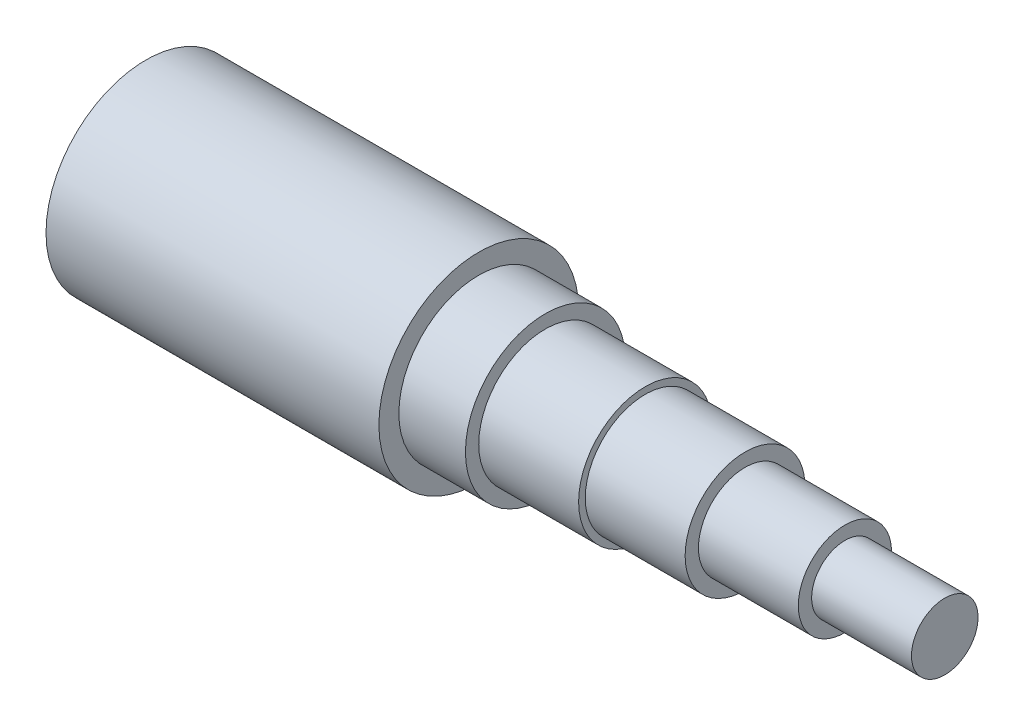
ISO-10303-21;
HEADER;
FILE_DESCRIPTION(('STEP AP214'),'2;1');
FILE_NAME('part.step','',(''),(''),'','','');
FILE_SCHEMA(('AUTOMOTIVE_DESIGN { 1 0 10303 214 1 1 1 1 }'));
ENDSEC;
DATA;
#1=APPLICATION_CONTEXT('core data for automotive mechanical design processes');
#2=APPLICATION_PROTOCOL_DEFINITION('international standard','automotive_design',2000,#1);
#3=PRODUCT_CONTEXT('',#1,'mechanical');
#4=PRODUCT('Part','Part','',(#3));
#5=PRODUCT_RELATED_PRODUCT_CATEGORY('part','',(#4));
#6=PRODUCT_DEFINITION_FORMATION('','',#4);
#7=PRODUCT_DEFINITION_CONTEXT('part definition',#1,'design');
#8=PRODUCT_DEFINITION('design','',#6,#7);
#9=PRODUCT_DEFINITION_SHAPE('','',#8);
#10=(LENGTH_UNIT() NAMED_UNIT(*) SI_UNIT(.MILLI.,.METRE.));
#11=(NAMED_UNIT(*) PLANE_ANGLE_UNIT() SI_UNIT($,.RADIAN.));
#12=(NAMED_UNIT(*) SI_UNIT($,.STERADIAN.) SOLID_ANGLE_UNIT());
#13=UNCERTAINTY_MEASURE_WITH_UNIT(LENGTH_MEASURE(1.E-05),#10,'distance_accuracy_value','');
#14=(GEOMETRIC_REPRESENTATION_CONTEXT(3) GLOBAL_UNCERTAINTY_ASSIGNED_CONTEXT((#13)) GLOBAL_UNIT_ASSIGNED_CONTEXT((#10,
#11,#12)) REPRESENTATION_CONTEXT('',''));
#15=CARTESIAN_POINT('',(0.,0.,0.));
#16=DIRECTION('',(0.,0.,1.));
#17=DIRECTION('',(1.,0.,0.));
#18=AXIS2_PLACEMENT_3D('',#15,#16,#17);
#19=CARTESIAN_POINT('',(0.,0.,0.));
#20=DIRECTION('',(-1.,0.,0.));
#21=DIRECTION('',(0.,0.,1.));
#22=AXIS2_PLACEMENT_3D('',#19,#20,#21);
#23=PLANE('',#22);
#24=CARTESIAN_POINT('',(0.,0.,0.));
#25=DIRECTION('',(-1.,0.,0.));
#26=DIRECTION('',(0.,0.,1.));
#27=AXIS2_PLACEMENT_3D('',#24,#25,#26);
#28=CIRCLE('',#27,9.525);
#29=CARTESIAN_POINT('',(0.,0.,9.525));
#30=VERTEX_POINT('',#29);
#31=EDGE_CURVE('E88',#30,#30,#28,.T.);
#32=ORIENTED_EDGE('',*,*,#31,.T.);
#33=EDGE_LOOP('',(#32));
#34=FACE_BOUND('',#33,.T.);
#35=ADVANCED_FACE('F37',(#34),#23,.T.);
#36=CARTESIAN_POINT('',(76.2,0.,0.));
#37=DIRECTION('',(1.,0.,0.));
#38=DIRECTION('',(0.,0.,-1.));
#39=AXIS2_PLACEMENT_3D('',#36,#37,#38);
#40=PLANE('',#39);
#41=CARTESIAN_POINT('',(76.2,0.,0.));
#42=DIRECTION('',(-1.,0.,0.));
#43=DIRECTION('',(0.,0.,1.));
#44=AXIS2_PLACEMENT_3D('',#41,#42,#43);
#45=CIRCLE('',#44,3.175);
#46=CARTESIAN_POINT('',(76.2,0.,3.175));
#47=VERTEX_POINT('',#46);
#48=EDGE_CURVE('E10',#47,#47,#45,.T.);
#49=ORIENTED_EDGE('',*,*,#48,.F.);
#50=EDGE_LOOP('',(#49));
#51=FACE_BOUND('',#50,.T.);
#52=ADVANCED_FACE('F106',(#51),#40,.T.);
#53=CARTESIAN_POINT('',(0.,0.,0.));
#54=DIRECTION('',(-1.,0.,0.));
#55=DIRECTION('',(0.,0.,1.));
#56=AXIS2_PLACEMENT_3D('',#53,#54,#55);
#57=CYLINDRICAL_SURFACE('',#56,3.175);
#58=ORIENTED_EDGE('',*,*,#48,.T.);
#59=EDGE_LOOP('',(#58));
#60=FACE_BOUND('',#59,.T.);
#61=CARTESIAN_POINT('',(66.675,0.,0.));
#62=DIRECTION('',(-1.,0.,0.));
#63=DIRECTION('',(0.,0.,1.));
#64=AXIS2_PLACEMENT_3D('',#61,#62,#63);
#65=CIRCLE('',#64,3.175);
#66=CARTESIAN_POINT('',(66.675,0.,3.175));
#67=VERTEX_POINT('',#66);
#68=EDGE_CURVE('E44',#67,#67,#65,.T.);
#69=ORIENTED_EDGE('',*,*,#68,.F.);
#70=EDGE_LOOP('',(#69));
#71=FACE_BOUND('',#70,.T.);
#72=ADVANCED_FACE('F110',(#60,#71),#57,.T.);
#73=CARTESIAN_POINT('',(66.675,0.,0.));
#74=DIRECTION('',(1.,0.,0.));
#75=DIRECTION('',(0.,0.,-1.));
#76=AXIS2_PLACEMENT_3D('',#73,#74,#75);
#77=PLANE('',#76);
#78=ORIENTED_EDGE('',*,*,#68,.T.);
#79=EDGE_LOOP('',(#78));
#80=FACE_BOUND('',#79,.T.);
#81=CARTESIAN_POINT('',(66.675,0.,0.));
#82=DIRECTION('',(-1.,0.,0.));
#83=DIRECTION('',(0.,0.,1.));
#84=AXIS2_PLACEMENT_3D('',#81,#82,#83);
#85=CIRCLE('',#84,4.445);
#86=CARTESIAN_POINT('',(66.675,0.,4.445));
#87=VERTEX_POINT('',#86);
#88=EDGE_CURVE('E49',#87,#87,#85,.T.);
#89=ORIENTED_EDGE('',*,*,#88,.F.);
#90=EDGE_LOOP('',(#89));
#91=FACE_BOUND('',#90,.T.);
#92=ADVANCED_FACE('F115',(#80,#91),#77,.T.);
#93=CARTESIAN_POINT('',(0.,0.,0.));
#94=DIRECTION('',(-1.,0.,0.));
#95=DIRECTION('',(0.,0.,1.));
#96=AXIS2_PLACEMENT_3D('',#93,#94,#95);
#97=CYLINDRICAL_SURFACE('',#96,4.445);
#98=ORIENTED_EDGE('',*,*,#88,.T.);
#99=EDGE_LOOP('',(#98));
#100=FACE_BOUND('',#99,.T.);
#101=CARTESIAN_POINT('',(57.15,0.,0.));
#102=DIRECTION('',(-1.,0.,0.));
#103=DIRECTION('',(0.,0.,1.));
#104=AXIS2_PLACEMENT_3D('',#101,#102,#103);
#105=CIRCLE('',#104,4.445);
#106=CARTESIAN_POINT('',(57.15,0.,4.445));
#107=VERTEX_POINT('',#106);
#108=EDGE_CURVE('E54',#107,#107,#105,.T.);
#109=ORIENTED_EDGE('',*,*,#108,.F.);
#110=EDGE_LOOP('',(#109));
#111=FACE_BOUND('',#110,.T.);
#112=ADVANCED_FACE('F120',(#100,#111),#97,.T.);
#113=CARTESIAN_POINT('',(57.15,0.,0.));
#114=DIRECTION('',(1.,0.,0.));
#115=DIRECTION('',(0.,0.,-1.));
#116=AXIS2_PLACEMENT_3D('',#113,#114,#115);
#117=PLANE('',#116);
#118=ORIENTED_EDGE('',*,*,#108,.T.);
#119=EDGE_LOOP('',(#118));
#120=FACE_BOUND('',#119,.T.);
#121=CARTESIAN_POINT('',(57.15,0.,0.));
#122=DIRECTION('',(-1.,0.,0.));
#123=DIRECTION('',(0.,0.,1.));
#124=AXIS2_PLACEMENT_3D('',#121,#122,#123);
#125=CIRCLE('',#124,5.715);
#126=CARTESIAN_POINT('',(57.15,0.,5.715));
#127=VERTEX_POINT('',#126);
#128=EDGE_CURVE('E60',#127,#127,#125,.T.);
#129=ORIENTED_EDGE('',*,*,#128,.F.);
#130=EDGE_LOOP('',(#129));
#131=FACE_BOUND('',#130,.T.);
#132=ADVANCED_FACE('F123',(#120,#131),#117,.T.);
#133=CARTESIAN_POINT('',(0.,0.,0.));
#134=DIRECTION('',(-1.,0.,0.));
#135=DIRECTION('',(0.,0.,1.));
#136=AXIS2_PLACEMENT_3D('',#133,#134,#135);
#137=CYLINDRICAL_SURFACE('',#136,5.715);
#138=ORIENTED_EDGE('',*,*,#128,.T.);
#139=EDGE_LOOP('',(#138));
#140=FACE_BOUND('',#139,.T.);
#141=CARTESIAN_POINT('',(47.625,0.,0.));
#142=DIRECTION('',(-1.,0.,0.));
#143=DIRECTION('',(0.,0.,1.));
#144=AXIS2_PLACEMENT_3D('',#141,#142,#143);
#145=CIRCLE('',#144,5.715);
#146=CARTESIAN_POINT('',(47.625,0.,5.715));
#147=VERTEX_POINT('',#146);
#148=EDGE_CURVE('E64',#147,#147,#145,.T.);
#149=ORIENTED_EDGE('',*,*,#148,.F.);
#150=EDGE_LOOP('',(#149));
#151=FACE_BOUND('',#150,.T.);
#152=ADVANCED_FACE('F127',(#140,#151),#137,.T.);
#153=CARTESIAN_POINT('',(47.625,0.,0.));
#154=DIRECTION('',(1.,0.,0.));
#155=DIRECTION('',(0.,0.,-1.));
#156=AXIS2_PLACEMENT_3D('',#153,#154,#155);
#157=PLANE('',#156);
#158=ORIENTED_EDGE('',*,*,#148,.T.);
#159=EDGE_LOOP('',(#158));
#160=FACE_BOUND('',#159,.T.);
#161=CARTESIAN_POINT('',(47.625,0.,0.));
#162=DIRECTION('',(-1.,0.,0.));
#163=DIRECTION('',(0.,0.,1.));
#164=AXIS2_PLACEMENT_3D('',#161,#162,#163);
#165=CIRCLE('',#164,6.35);
#166=CARTESIAN_POINT('',(47.625,0.,6.35));
#167=VERTEX_POINT('',#166);
#168=EDGE_CURVE('E68',#167,#167,#165,.T.);
#169=ORIENTED_EDGE('',*,*,#168,.F.);
#170=EDGE_LOOP('',(#169));
#171=FACE_BOUND('',#170,.T.);
#172=ADVANCED_FACE('F131',(#160,#171),#157,.T.);
#173=CARTESIAN_POINT('',(0.,0.,0.));
#174=DIRECTION('',(-1.,0.,0.));
#175=DIRECTION('',(0.,0.,1.));
#176=AXIS2_PLACEMENT_3D('',#173,#174,#175);
#177=CYLINDRICAL_SURFACE('',#176,6.35);
#178=ORIENTED_EDGE('',*,*,#168,.T.);
#179=EDGE_LOOP('',(#178));
#180=FACE_BOUND('',#179,.T.);
#181=CARTESIAN_POINT('',(38.1,0.,0.));
#182=DIRECTION('',(-1.,0.,0.));
#183=DIRECTION('',(0.,0.,1.));
#184=AXIS2_PLACEMENT_3D('',#181,#182,#183);
#185=CIRCLE('',#184,6.35);
#186=CARTESIAN_POINT('',(38.1,0.,6.35));
#187=VERTEX_POINT('',#186);
#188=EDGE_CURVE('E72',#187,#187,#185,.T.);
#189=ORIENTED_EDGE('',*,*,#188,.F.);
#190=EDGE_LOOP('',(#189));
#191=FACE_BOUND('',#190,.T.);
#192=ADVANCED_FACE('F135',(#180,#191),#177,.T.);
#193=CARTESIAN_POINT('',(38.1,0.,0.));
#194=DIRECTION('',(1.,0.,0.));
#195=DIRECTION('',(0.,0.,-1.));
#196=AXIS2_PLACEMENT_3D('',#193,#194,#195);
#197=PLANE('',#196);
#198=ORIENTED_EDGE('',*,*,#188,.T.);
#199=EDGE_LOOP('',(#198));
#200=FACE_BOUND('',#199,.T.);
#201=CARTESIAN_POINT('',(38.1,0.,0.));
#202=DIRECTION('',(-1.,0.,0.));
#203=DIRECTION('',(0.,0.,1.));
#204=AXIS2_PLACEMENT_3D('',#201,#202,#203);
#205=CIRCLE('',#204,7.62);
#206=CARTESIAN_POINT('',(38.1,0.,7.62));
#207=VERTEX_POINT('',#206);
#208=EDGE_CURVE('E76',#207,#207,#205,.T.);
#209=ORIENTED_EDGE('',*,*,#208,.F.);
#210=EDGE_LOOP('',(#209));
#211=FACE_BOUND('',#210,.T.);
#212=ADVANCED_FACE('F139',(#200,#211),#197,.T.);
#213=CARTESIAN_POINT('',(0.,0.,0.));
#214=DIRECTION('',(-1.,0.,0.));
#215=DIRECTION('',(0.,0.,1.));
#216=AXIS2_PLACEMENT_3D('',#213,#214,#215);
#217=CYLINDRICAL_SURFACE('',#216,7.62);
#218=ORIENTED_EDGE('',*,*,#208,.T.);
#219=EDGE_LOOP('',(#218));
#220=FACE_BOUND('',#219,.T.);
#221=CARTESIAN_POINT('',(31.75,0.,0.));
#222=DIRECTION('',(-1.,0.,0.));
#223=DIRECTION('',(0.,0.,1.));
#224=AXIS2_PLACEMENT_3D('',#221,#222,#223);
#225=CIRCLE('',#224,7.62);
#226=CARTESIAN_POINT('',(31.75,0.,7.62));
#227=VERTEX_POINT('',#226);
#228=EDGE_CURVE('E80',#227,#227,#225,.T.);
#229=ORIENTED_EDGE('',*,*,#228,.F.);
#230=EDGE_LOOP('',(#229));
#231=FACE_BOUND('',#230,.T.);
#232=ADVANCED_FACE('F102',(#220,#231),#217,.T.);
#233=CARTESIAN_POINT('',(31.75,0.,0.));
#234=DIRECTION('',(1.,0.,0.));
#235=DIRECTION('',(0.,0.,-1.));
#236=AXIS2_PLACEMENT_3D('',#233,#234,#235);
#237=PLANE('',#236);
#238=ORIENTED_EDGE('',*,*,#228,.T.);
#239=EDGE_LOOP('',(#238));
#240=FACE_BOUND('',#239,.T.);
#241=CARTESIAN_POINT('',(31.75,0.,0.));
#242=DIRECTION('',(-1.,0.,0.));
#243=DIRECTION('',(0.,0.,1.));
#244=AXIS2_PLACEMENT_3D('',#241,#242,#243);
#245=CIRCLE('',#244,9.525);
#246=CARTESIAN_POINT('',(31.75,0.,9.525));
#247=VERTEX_POINT('',#246);
#248=EDGE_CURVE('E84',#247,#247,#245,.T.);
#249=ORIENTED_EDGE('',*,*,#248,.F.);
#250=EDGE_LOOP('',(#249));
#251=FACE_BOUND('',#250,.T.);
#252=ADVANCED_FACE('F96',(#240,#251),#237,.T.);
#253=CARTESIAN_POINT('',(0.,0.,0.));
#254=DIRECTION('',(-1.,0.,0.));
#255=DIRECTION('',(0.,0.,1.));
#256=AXIS2_PLACEMENT_3D('',#253,#254,#255);
#257=CYLINDRICAL_SURFACE('',#256,9.525);
#258=ORIENTED_EDGE('',*,*,#248,.T.);
#259=EDGE_LOOP('',(#258));
#260=FACE_BOUND('',#259,.T.);
#261=ORIENTED_EDGE('',*,*,#31,.F.);
#262=EDGE_LOOP('',(#261));
#263=FACE_BOUND('',#262,.T.);
#264=ADVANCED_FACE('F94',(#260,#263),#257,.T.);
#265=CLOSED_SHELL('',(#35,#52,#72,#92,#112,#132,#152,#172,#192,#212,#232,#252,#264));
#266=MANIFOLD_SOLID_BREP('B2',#265);
#267=ADVANCED_BREP_SHAPE_REPRESENTATION('',(#18,#266),#14);
#268=SHAPE_DEFINITION_REPRESENTATION(#9,#267);
ENDSEC;
END-ISO-10303-21;
